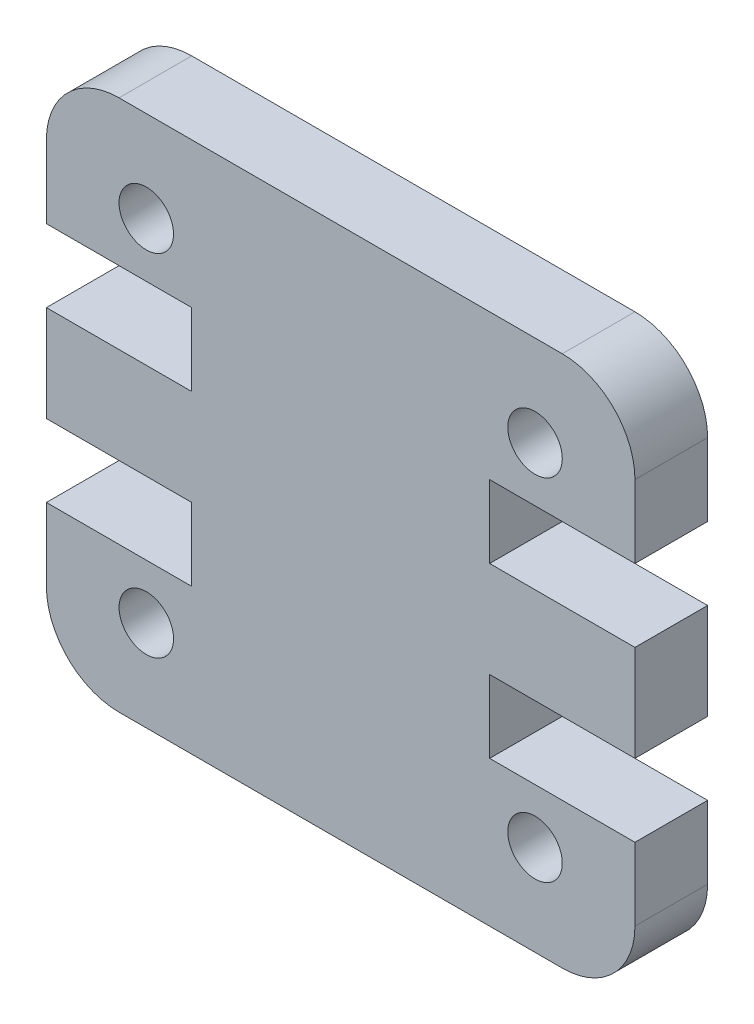
ISO-10303-21;
HEADER;
FILE_DESCRIPTION(('STEP AP214'),'2;1');
FILE_NAME('part.step','',(''),(''),'','','');
FILE_SCHEMA(('AUTOMOTIVE_DESIGN { 1 0 10303 214 1 1 1 1 }'));
ENDSEC;
DATA;
#1=APPLICATION_CONTEXT('core data for automotive mechanical design processes');
#2=APPLICATION_PROTOCOL_DEFINITION('international standard','automotive_design',2000,#1);
#3=PRODUCT_CONTEXT('',#1,'mechanical');
#4=PRODUCT('Part','Part','',(#3));
#5=PRODUCT_RELATED_PRODUCT_CATEGORY('part','',(#4));
#6=PRODUCT_DEFINITION_FORMATION('','',#4);
#7=PRODUCT_DEFINITION_CONTEXT('part definition',#1,'design');
#8=PRODUCT_DEFINITION('design','',#6,#7);
#9=PRODUCT_DEFINITION_SHAPE('','',#8);
#10=(LENGTH_UNIT() NAMED_UNIT(*) SI_UNIT(.MILLI.,.METRE.));
#11=(NAMED_UNIT(*) PLANE_ANGLE_UNIT() SI_UNIT($,.RADIAN.));
#12=(NAMED_UNIT(*) SI_UNIT($,.STERADIAN.) SOLID_ANGLE_UNIT());
#13=UNCERTAINTY_MEASURE_WITH_UNIT(LENGTH_MEASURE(1.E-05),#10,'distance_accuracy_value','');
#14=(GEOMETRIC_REPRESENTATION_CONTEXT(3) GLOBAL_UNCERTAINTY_ASSIGNED_CONTEXT((#13)) GLOBAL_UNIT_ASSIGNED_CONTEXT((#10,
#11,#12)) REPRESENTATION_CONTEXT('',''));
#15=CARTESIAN_POINT('',(0.,0.,0.));
#16=DIRECTION('',(0.,0.,1.));
#17=DIRECTION('',(1.,0.,0.));
#18=AXIS2_PLACEMENT_3D('',#15,#16,#17);
#19=CARTESIAN_POINT('',(14.2,2.,2.));
#20=DIRECTION('',(0.,0.,-1.));
#21=DIRECTION('',(-1.,0.,0.));
#22=AXIS2_PLACEMENT_3D('',#19,#20,#21);
#23=PLANE('',#22);
#24=CARTESIAN_POINT('',(13.4499999999986,12.1450000000001,2.));
#25=DIRECTION('',(0.,0.,1.));
#26=DIRECTION('',(1.,0.,0.));
#27=AXIS2_PLACEMENT_3D('',#24,#25,#26);
#28=CIRCLE('',#27,0.750000000000002);
#29=CARTESIAN_POINT('',(14.1999999999986,12.1450000000001,2.));
#30=VERTEX_POINT('',#29);
#31=EDGE_CURVE('E448',#30,#30,#28,.T.);
#32=ORIENTED_EDGE('',*,*,#31,.F.);
#33=EDGE_LOOP('',(#32));
#34=FACE_BOUND('',#33,.T.);
#35=CARTESIAN_POINT('',(13.4499999999986,2.4999999999999,2.));
#36=DIRECTION('',(0.,0.,1.));
#37=DIRECTION('',(-1.,0.,0.));
#38=AXIS2_PLACEMENT_3D('',#35,#36,#37);
#39=CIRCLE('',#38,0.750000000000002);
#40=CARTESIAN_POINT('',(12.6999999999986,2.4999999999999,2.));
#41=VERTEX_POINT('',#40);
#42=EDGE_CURVE('E230',#41,#41,#39,.T.);
#43=ORIENTED_EDGE('',*,*,#42,.F.);
#44=EDGE_LOOP('',(#43));
#45=FACE_BOUND('',#44,.T.);
#46=CARTESIAN_POINT('',(14.2,2.,2.));
#47=DIRECTION('',(0.,0.,1.));
#48=DIRECTION('',(-1.,0.,0.));
#49=AXIS2_PLACEMENT_3D('',#46,#47,#48);
#50=CIRCLE('',#49,2.);
#51=CARTESIAN_POINT('',(14.2,0.,2.));
#52=VERTEX_POINT('',#51);
#53=CARTESIAN_POINT('',(16.2,2.,2.));
#54=VERTEX_POINT('',#53);
#55=EDGE_CURVE('E273',#52,#54,#50,.T.);
#56=ORIENTED_EDGE('',*,*,#55,.T.);
#57=DIRECTION('',(0.,1.,0.));
#58=VECTOR('',#57,1.);
#59=CARTESIAN_POINT('',(16.2,4.,2.));
#60=LINE('',#59,#58);
#61=CARTESIAN_POINT('',(16.2,4.,2.));
#62=VERTEX_POINT('',#61);
#63=EDGE_CURVE('E141',#54,#62,#60,.T.);
#64=ORIENTED_EDGE('',*,*,#63,.T.);
#65=DIRECTION('',(-1.,0.,0.));
#66=VECTOR('',#65,1.);
#67=CARTESIAN_POINT('',(12.2,4.,2.));
#68=LINE('',#67,#66);
#69=CARTESIAN_POINT('',(12.2,4.,2.));
#70=VERTEX_POINT('',#69);
#71=EDGE_CURVE('E336',#62,#70,#68,.T.);
#72=ORIENTED_EDGE('',*,*,#71,.T.);
#73=DIRECTION('',(0.,1.,0.));
#74=VECTOR('',#73,1.);
#75=CARTESIAN_POINT('',(12.2,6.,2.));
#76=LINE('',#75,#74);
#77=CARTESIAN_POINT('',(12.2,6.,2.));
#78=VERTEX_POINT('',#77);
#79=EDGE_CURVE('E355',#70,#78,#76,.T.);
#80=ORIENTED_EDGE('',*,*,#79,.T.);
#81=DIRECTION('',(1.,0.,0.));
#82=VECTOR('',#81,1.);
#83=CARTESIAN_POINT('',(16.2,6.,2.));
#84=LINE('',#83,#82);
#85=CARTESIAN_POINT('',(16.2,6.,2.));
#86=VERTEX_POINT('',#85);
#87=EDGE_CURVE('E352',#78,#86,#84,.T.);
#88=ORIENTED_EDGE('',*,*,#87,.T.);
#89=DIRECTION('',(0.,1.,0.));
#90=VECTOR('',#89,1.);
#91=CARTESIAN_POINT('',(16.2,8.645,2.));
#92=LINE('',#91,#90);
#93=CARTESIAN_POINT('',(16.2,8.645,2.));
#94=VERTEX_POINT('',#93);
#95=EDGE_CURVE('E354',#86,#94,#92,.T.);
#96=ORIENTED_EDGE('',*,*,#95,.T.);
#97=DIRECTION('',(-1.,0.,0.));
#98=VECTOR('',#97,1.);
#99=CARTESIAN_POINT('',(16.2,8.645,2.));
#100=LINE('',#99,#98);
#101=CARTESIAN_POINT('',(12.2,8.645,2.));
#102=VERTEX_POINT('',#101);
#103=EDGE_CURVE('E357',#94,#102,#100,.T.);
#104=ORIENTED_EDGE('',*,*,#103,.T.);
#105=DIRECTION('',(0.,1.,0.));
#106=VECTOR('',#105,1.);
#107=CARTESIAN_POINT('',(12.2,8.645,2.));
#108=LINE('',#107,#106);
#109=CARTESIAN_POINT('',(12.2,10.645,2.));
#110=VERTEX_POINT('',#109);
#111=EDGE_CURVE('E363',#102,#110,#108,.T.);
#112=ORIENTED_EDGE('',*,*,#111,.T.);
#113=DIRECTION('',(1.,0.,0.));
#114=VECTOR('',#113,1.);
#115=CARTESIAN_POINT('',(12.2,10.645,2.));
#116=LINE('',#115,#114);
#117=CARTESIAN_POINT('',(16.2,10.645,2.));
#118=VERTEX_POINT('',#117);
#119=EDGE_CURVE('E365',#110,#118,#116,.T.);
#120=ORIENTED_EDGE('',*,*,#119,.T.);
#121=DIRECTION('',(0.,1.,0.));
#122=VECTOR('',#121,1.);
#123=CARTESIAN_POINT('',(16.2,10.645,2.));
#124=LINE('',#123,#122);
#125=CARTESIAN_POINT('',(16.2,12.645,2.));
#126=VERTEX_POINT('',#125);
#127=EDGE_CURVE('E367',#118,#126,#124,.T.);
#128=ORIENTED_EDGE('',*,*,#127,.T.);
#129=CARTESIAN_POINT('',(14.2,12.645,2.));
#130=DIRECTION('',(0.,0.,1.));
#131=DIRECTION('',(1.,0.,0.));
#132=AXIS2_PLACEMENT_3D('',#129,#130,#131);
#133=CIRCLE('',#132,2.);
#134=CARTESIAN_POINT('',(14.2,14.645,2.));
#135=VERTEX_POINT('',#134);
#136=EDGE_CURVE('E369',#126,#135,#133,.T.);
#137=ORIENTED_EDGE('',*,*,#136,.T.);
#138=DIRECTION('',(-1.,0.,0.));
#139=VECTOR('',#138,1.);
#140=CARTESIAN_POINT('',(2.,14.645,2.));
#141=LINE('',#140,#139);
#142=CARTESIAN_POINT('',(2.,14.645,2.));
#143=VERTEX_POINT('',#142);
#144=EDGE_CURVE('E371',#135,#143,#141,.T.);
#145=ORIENTED_EDGE('',*,*,#144,.T.);
#146=CARTESIAN_POINT('',(2.,12.645,2.));
#147=DIRECTION('',(0.,0.,1.));
#148=DIRECTION('',(-1.,0.,0.));
#149=AXIS2_PLACEMENT_3D('',#146,#147,#148);
#150=CIRCLE('',#149,2.);
#151=CARTESIAN_POINT('',(0.,12.645,2.));
#152=VERTEX_POINT('',#151);
#153=EDGE_CURVE('E373',#143,#152,#150,.T.);
#154=ORIENTED_EDGE('',*,*,#153,.T.);
#155=DIRECTION('',(0.,-1.,0.));
#156=VECTOR('',#155,1.);
#157=CARTESIAN_POINT('',(0.,10.645,2.));
#158=LINE('',#157,#156);
#159=CARTESIAN_POINT('',(0.,10.645,2.));
#160=VERTEX_POINT('',#159);
#161=EDGE_CURVE('E375',#152,#160,#158,.T.);
#162=ORIENTED_EDGE('',*,*,#161,.T.);
#163=DIRECTION('',(1.,0.,0.));
#164=VECTOR('',#163,1.);
#165=CARTESIAN_POINT('',(4.,10.645,2.));
#166=LINE('',#165,#164);
#167=CARTESIAN_POINT('',(4.,10.645,2.));
#168=VERTEX_POINT('',#167);
#169=EDGE_CURVE('E377',#160,#168,#166,.T.);
#170=ORIENTED_EDGE('',*,*,#169,.T.);
#171=DIRECTION('',(0.,-1.,0.));
#172=VECTOR('',#171,1.);
#173=CARTESIAN_POINT('',(4.,8.645,2.));
#174=LINE('',#173,#172);
#175=CARTESIAN_POINT('',(4.,8.645,2.));
#176=VERTEX_POINT('',#175);
#177=EDGE_CURVE('E379',#168,#176,#174,.T.);
#178=ORIENTED_EDGE('',*,*,#177,.T.);
#179=DIRECTION('',(-1.,0.,0.));
#180=VECTOR('',#179,1.);
#181=CARTESIAN_POINT('',(0.,8.645,2.));
#182=LINE('',#181,#180);
#183=CARTESIAN_POINT('',(0.,8.645,2.));
#184=VERTEX_POINT('',#183);
#185=EDGE_CURVE('E381',#176,#184,#182,.T.);
#186=ORIENTED_EDGE('',*,*,#185,.T.);
#187=DIRECTION('',(0.,-1.,0.));
#188=VECTOR('',#187,1.);
#189=CARTESIAN_POINT('',(0.,8.645,2.));
#190=LINE('',#189,#188);
#191=CARTESIAN_POINT('',(0.,6.00000000000003,2.));
#192=VERTEX_POINT('',#191);
#193=EDGE_CURVE('E383',#184,#192,#190,.T.);
#194=ORIENTED_EDGE('',*,*,#193,.T.);
#195=DIRECTION('',(1.,0.,0.));
#196=VECTOR('',#195,1.);
#197=CARTESIAN_POINT('',(0.,6.00000000000003,2.));
#198=LINE('',#197,#196);
#199=CARTESIAN_POINT('',(4.00000000000003,6.00000000000003,2.));
#200=VERTEX_POINT('',#199);
#201=EDGE_CURVE('E385',#192,#200,#198,.T.);
#202=ORIENTED_EDGE('',*,*,#201,.T.);
#203=DIRECTION('',(0.,-1.,0.));
#204=VECTOR('',#203,1.);
#205=CARTESIAN_POINT('',(4.00000000000003,6.00000000000003,2.));
#206=LINE('',#205,#204);
#207=CARTESIAN_POINT('',(4.00000000000003,4.00000000000002,2.));
#208=VERTEX_POINT('',#207);
#209=EDGE_CURVE('E387',#200,#208,#206,.T.);
#210=ORIENTED_EDGE('',*,*,#209,.T.);
#211=DIRECTION('',(-1.,0.,0.));
#212=VECTOR('',#211,1.);
#213=CARTESIAN_POINT('',(4.00000000000003,4.00000000000002,2.));
#214=LINE('',#213,#212);
#215=CARTESIAN_POINT('',(0.,4.00000000000003,2.));
#216=VERTEX_POINT('',#215);
#217=EDGE_CURVE('E208',#208,#216,#214,.T.);
#218=ORIENTED_EDGE('',*,*,#217,.T.);
#219=DIRECTION('',(0.,-1.,0.));
#220=VECTOR('',#219,1.);
#221=CARTESIAN_POINT('',(0.,4.00000000000003,2.));
#222=LINE('',#221,#220);
#223=CARTESIAN_POINT('',(0.,2.00000000000003,2.));
#224=VERTEX_POINT('',#223);
#225=EDGE_CURVE('E202',#216,#224,#222,.T.);
#226=ORIENTED_EDGE('',*,*,#225,.T.);
#227=CARTESIAN_POINT('',(2.,2.,2.));
#228=DIRECTION('',(0.,0.,1.));
#229=DIRECTION('',(1.,0.,0.));
#230=AXIS2_PLACEMENT_3D('',#227,#228,#229);
#231=CIRCLE('',#230,2.);
#232=CARTESIAN_POINT('',(2.,0.,2.));
#233=VERTEX_POINT('',#232);
#234=EDGE_CURVE('E206',#224,#233,#231,.T.);
#235=ORIENTED_EDGE('',*,*,#234,.T.);
#236=DIRECTION('',(1.,0.,0.));
#237=VECTOR('',#236,1.);
#238=CARTESIAN_POINT('',(2.,0.,2.));
#239=LINE('',#238,#237);
#240=EDGE_CURVE('E50',#233,#52,#239,.T.);
#241=ORIENTED_EDGE('',*,*,#240,.T.);
#242=EDGE_LOOP('',(#56,#64,#72,#80,#88,#96,#104,#112,#120,#128,#137,#145,#154,#162,#170,#178,
#186,#194,#202,#210,#218,#226,#235,#241));
#243=FACE_BOUND('',#242,.T.);
#244=CARTESIAN_POINT('',(2.75000000000139,12.1450000000001,2.));
#245=DIRECTION('',(0.,0.,1.));
#246=DIRECTION('',(-1.,0.,0.));
#247=AXIS2_PLACEMENT_3D('',#244,#245,#246);
#248=CIRCLE('',#247,0.750000000000001);
#249=CARTESIAN_POINT('',(2.00000000000139,12.1450000000001,2.));
#250=VERTEX_POINT('',#249);
#251=EDGE_CURVE('E454',#250,#250,#248,.T.);
#252=ORIENTED_EDGE('',*,*,#251,.F.);
#253=EDGE_LOOP('',(#252));
#254=FACE_BOUND('',#253,.T.);
#255=CARTESIAN_POINT('',(2.75000000000139,2.4999999999999,2.));
#256=DIRECTION('',(0.,0.,1.));
#257=DIRECTION('',(1.,0.,0.));
#258=AXIS2_PLACEMENT_3D('',#255,#256,#257);
#259=CIRCLE('',#258,0.75);
#260=CARTESIAN_POINT('',(3.50000000000139,2.4999999999999,2.));
#261=VERTEX_POINT('',#260);
#262=EDGE_CURVE('E439',#261,#261,#259,.T.);
#263=ORIENTED_EDGE('',*,*,#262,.F.);
#264=EDGE_LOOP('',(#263));
#265=FACE_BOUND('',#264,.T.);
#266=ADVANCED_FACE('F33',(#34,#45,#243,#254,#265),#23,.F.);
#267=CARTESIAN_POINT('',(14.2,2.,0.));
#268=DIRECTION('',(0.,0.,-1.));
#269=DIRECTION('',(-1.,0.,0.));
#270=AXIS2_PLACEMENT_3D('',#267,#268,#269);
#271=PLANE('',#270);
#272=CARTESIAN_POINT('',(13.4499999999986,12.1450000000001,0.));
#273=DIRECTION('',(0.,0.,1.));
#274=DIRECTION('',(1.,0.,0.));
#275=AXIS2_PLACEMENT_3D('',#272,#273,#274);
#276=CIRCLE('',#275,0.750000000000002);
#277=CARTESIAN_POINT('',(14.1999999999986,12.1450000000001,0.));
#278=VERTEX_POINT('',#277);
#279=EDGE_CURVE('E445',#278,#278,#276,.T.);
#280=ORIENTED_EDGE('',*,*,#279,.T.);
#281=EDGE_LOOP('',(#280));
#282=FACE_BOUND('',#281,.T.);
#283=CARTESIAN_POINT('',(13.4499999999986,2.4999999999999,0.));
#284=DIRECTION('',(0.,0.,1.));
#285=DIRECTION('',(-1.,0.,0.));
#286=AXIS2_PLACEMENT_3D('',#283,#284,#285);
#287=CIRCLE('',#286,0.750000000000002);
#288=CARTESIAN_POINT('',(12.6999999999986,2.4999999999999,0.));
#289=VERTEX_POINT('',#288);
#290=EDGE_CURVE('E457',#289,#289,#287,.T.);
#291=ORIENTED_EDGE('',*,*,#290,.T.);
#292=EDGE_LOOP('',(#291));
#293=FACE_BOUND('',#292,.T.);
#294=CARTESIAN_POINT('',(14.2,2.,0.));
#295=DIRECTION('',(0.,0.,1.));
#296=DIRECTION('',(-1.,0.,0.));
#297=AXIS2_PLACEMENT_3D('',#294,#295,#296);
#298=CIRCLE('',#297,2.);
#299=CARTESIAN_POINT('',(14.2,0.,0.));
#300=VERTEX_POINT('',#299);
#301=CARTESIAN_POINT('',(16.2,2.,0.));
#302=VERTEX_POINT('',#301);
#303=EDGE_CURVE('E226',#300,#302,#298,.T.);
#304=ORIENTED_EDGE('',*,*,#303,.F.);
#305=DIRECTION('',(1.,0.,0.));
#306=VECTOR('',#305,1.);
#307=CARTESIAN_POINT('',(2.,0.,0.));
#308=LINE('',#307,#306);
#309=CARTESIAN_POINT('',(2.,0.,0.));
#310=VERTEX_POINT('',#309);
#311=EDGE_CURVE('E133',#310,#300,#308,.T.);
#312=ORIENTED_EDGE('',*,*,#311,.F.);
#313=CARTESIAN_POINT('',(2.,2.,0.));
#314=DIRECTION('',(0.,0.,1.));
#315=DIRECTION('',(1.,0.,0.));
#316=AXIS2_PLACEMENT_3D('',#313,#314,#315);
#317=CIRCLE('',#316,2.);
#318=CARTESIAN_POINT('',(0.,2.00000000000003,0.));
#319=VERTEX_POINT('',#318);
#320=EDGE_CURVE('E127',#319,#310,#317,.T.);
#321=ORIENTED_EDGE('',*,*,#320,.F.);
#322=DIRECTION('',(0.,-1.,0.));
#323=VECTOR('',#322,1.);
#324=CARTESIAN_POINT('',(0.,4.00000000000003,0.));
#325=LINE('',#324,#323);
#326=CARTESIAN_POINT('',(0.,4.00000000000003,0.));
#327=VERTEX_POINT('',#326);
#328=EDGE_CURVE('E216',#327,#319,#325,.T.);
#329=ORIENTED_EDGE('',*,*,#328,.F.);
#330=DIRECTION('',(-1.,0.,0.));
#331=VECTOR('',#330,1.);
#332=CARTESIAN_POINT('',(4.00000000000003,4.00000000000002,0.));
#333=LINE('',#332,#331);
#334=CARTESIAN_POINT('',(4.00000000000003,4.00000000000002,0.));
#335=VERTEX_POINT('',#334);
#336=EDGE_CURVE('E268',#335,#327,#333,.T.);
#337=ORIENTED_EDGE('',*,*,#336,.F.);
#338=DIRECTION('',(0.,-1.,0.));
#339=VECTOR('',#338,1.);
#340=CARTESIAN_POINT('',(4.00000000000003,6.00000000000003,0.));
#341=LINE('',#340,#339);
#342=CARTESIAN_POINT('',(4.00000000000003,6.00000000000003,0.));
#343=VERTEX_POINT('',#342);
#344=EDGE_CURVE('E266',#343,#335,#341,.T.);
#345=ORIENTED_EDGE('',*,*,#344,.F.);
#346=DIRECTION('',(1.,0.,0.));
#347=VECTOR('',#346,1.);
#348=CARTESIAN_POINT('',(0.,6.00000000000003,0.));
#349=LINE('',#348,#347);
#350=CARTESIAN_POINT('',(0.,6.00000000000003,0.));
#351=VERTEX_POINT('',#350);
#352=EDGE_CURVE('E264',#351,#343,#349,.T.);
#353=ORIENTED_EDGE('',*,*,#352,.F.);
#354=DIRECTION('',(0.,-1.,0.));
#355=VECTOR('',#354,1.);
#356=CARTESIAN_POINT('',(0.,8.645,0.));
#357=LINE('',#356,#355);
#358=CARTESIAN_POINT('',(0.,8.645,0.));
#359=VERTEX_POINT('',#358);
#360=EDGE_CURVE('E262',#359,#351,#357,.T.);
#361=ORIENTED_EDGE('',*,*,#360,.F.);
#362=DIRECTION('',(-1.,0.,0.));
#363=VECTOR('',#362,1.);
#364=CARTESIAN_POINT('',(0.,8.645,0.));
#365=LINE('',#364,#363);
#366=CARTESIAN_POINT('',(4.,8.645,0.));
#367=VERTEX_POINT('',#366);
#368=EDGE_CURVE('E260',#367,#359,#365,.T.);
#369=ORIENTED_EDGE('',*,*,#368,.F.);
#370=DIRECTION('',(0.,-1.,0.));
#371=VECTOR('',#370,1.);
#372=CARTESIAN_POINT('',(4.,8.645,0.));
#373=LINE('',#372,#371);
#374=CARTESIAN_POINT('',(4.,10.645,0.));
#375=VERTEX_POINT('',#374);
#376=EDGE_CURVE('E258',#375,#367,#373,.T.);
#377=ORIENTED_EDGE('',*,*,#376,.F.);
#378=DIRECTION('',(1.,0.,0.));
#379=VECTOR('',#378,1.);
#380=CARTESIAN_POINT('',(4.,10.645,0.));
#381=LINE('',#380,#379);
#382=CARTESIAN_POINT('',(0.,10.645,0.));
#383=VERTEX_POINT('',#382);
#384=EDGE_CURVE('E256',#383,#375,#381,.T.);
#385=ORIENTED_EDGE('',*,*,#384,.F.);
#386=DIRECTION('',(0.,-1.,0.));
#387=VECTOR('',#386,1.);
#388=CARTESIAN_POINT('',(0.,10.645,0.));
#389=LINE('',#388,#387);
#390=CARTESIAN_POINT('',(0.,12.645,0.));
#391=VERTEX_POINT('',#390);
#392=EDGE_CURVE('E254',#391,#383,#389,.T.);
#393=ORIENTED_EDGE('',*,*,#392,.F.);
#394=CARTESIAN_POINT('',(2.,12.645,0.));
#395=DIRECTION('',(0.,0.,1.));
#396=DIRECTION('',(-1.,0.,0.));
#397=AXIS2_PLACEMENT_3D('',#394,#395,#396);
#398=CIRCLE('',#397,2.);
#399=CARTESIAN_POINT('',(2.,14.645,0.));
#400=VERTEX_POINT('',#399);
#401=EDGE_CURVE('E252',#400,#391,#398,.T.);
#402=ORIENTED_EDGE('',*,*,#401,.F.);
#403=DIRECTION('',(-1.,0.,0.));
#404=VECTOR('',#403,1.);
#405=CARTESIAN_POINT('',(2.,14.645,0.));
#406=LINE('',#405,#404);
#407=CARTESIAN_POINT('',(14.2,14.645,0.));
#408=VERTEX_POINT('',#407);
#409=EDGE_CURVE('E250',#408,#400,#406,.T.);
#410=ORIENTED_EDGE('',*,*,#409,.F.);
#411=CARTESIAN_POINT('',(14.2,12.645,0.));
#412=DIRECTION('',(0.,0.,1.));
#413=DIRECTION('',(1.,0.,0.));
#414=AXIS2_PLACEMENT_3D('',#411,#412,#413);
#415=CIRCLE('',#414,2.);
#416=CARTESIAN_POINT('',(16.2,12.645,0.));
#417=VERTEX_POINT('',#416);
#418=EDGE_CURVE('E248',#417,#408,#415,.T.);
#419=ORIENTED_EDGE('',*,*,#418,.F.);
#420=DIRECTION('',(0.,1.,0.));
#421=VECTOR('',#420,1.);
#422=CARTESIAN_POINT('',(16.2,10.645,0.));
#423=LINE('',#422,#421);
#424=CARTESIAN_POINT('',(16.2,10.645,0.));
#425=VERTEX_POINT('',#424);
#426=EDGE_CURVE('E246',#425,#417,#423,.T.);
#427=ORIENTED_EDGE('',*,*,#426,.F.);
#428=DIRECTION('',(1.,0.,0.));
#429=VECTOR('',#428,1.);
#430=CARTESIAN_POINT('',(12.2,10.645,0.));
#431=LINE('',#430,#429);
#432=CARTESIAN_POINT('',(12.2,10.645,0.));
#433=VERTEX_POINT('',#432);
#434=EDGE_CURVE('E244',#433,#425,#431,.T.);
#435=ORIENTED_EDGE('',*,*,#434,.F.);
#436=DIRECTION('',(0.,1.,0.));
#437=VECTOR('',#436,1.);
#438=CARTESIAN_POINT('',(12.2,8.645,0.));
#439=LINE('',#438,#437);
#440=CARTESIAN_POINT('',(12.2,8.645,0.));
#441=VERTEX_POINT('',#440);
#442=EDGE_CURVE('E242',#441,#433,#439,.T.);
#443=ORIENTED_EDGE('',*,*,#442,.F.);
#444=DIRECTION('',(-1.,0.,0.));
#445=VECTOR('',#444,1.);
#446=CARTESIAN_POINT('',(16.2,8.645,0.));
#447=LINE('',#446,#445);
#448=CARTESIAN_POINT('',(16.2,8.645,0.));
#449=VERTEX_POINT('',#448);
#450=EDGE_CURVE('E240',#449,#441,#447,.T.);
#451=ORIENTED_EDGE('',*,*,#450,.F.);
#452=DIRECTION('',(0.,1.,0.));
#453=VECTOR('',#452,1.);
#454=CARTESIAN_POINT('',(16.2,8.645,0.));
#455=LINE('',#454,#453);
#456=CARTESIAN_POINT('',(16.2,6.,0.));
#457=VERTEX_POINT('',#456);
#458=EDGE_CURVE('E238',#457,#449,#455,.T.);
#459=ORIENTED_EDGE('',*,*,#458,.F.);
#460=DIRECTION('',(1.,0.,0.));
#461=VECTOR('',#460,1.);
#462=CARTESIAN_POINT('',(16.2,6.,0.));
#463=LINE('',#462,#461);
#464=CARTESIAN_POINT('',(12.2,6.,0.));
#465=VERTEX_POINT('',#464);
#466=EDGE_CURVE('E236',#465,#457,#463,.T.);
#467=ORIENTED_EDGE('',*,*,#466,.F.);
#468=DIRECTION('',(0.,1.,0.));
#469=VECTOR('',#468,1.);
#470=CARTESIAN_POINT('',(12.2,6.,0.));
#471=LINE('',#470,#469);
#472=CARTESIAN_POINT('',(12.2,4.,0.));
#473=VERTEX_POINT('',#472);
#474=EDGE_CURVE('E234',#473,#465,#471,.T.);
#475=ORIENTED_EDGE('',*,*,#474,.F.);
#476=DIRECTION('',(-1.,0.,0.));
#477=VECTOR('',#476,1.);
#478=CARTESIAN_POINT('',(12.2,4.,0.));
#479=LINE('',#478,#477);
#480=CARTESIAN_POINT('',(16.2,4.,0.));
#481=VERTEX_POINT('',#480);
#482=EDGE_CURVE('E232',#481,#473,#479,.T.);
#483=ORIENTED_EDGE('',*,*,#482,.F.);
#484=DIRECTION('',(0.,1.,0.));
#485=VECTOR('',#484,1.);
#486=CARTESIAN_POINT('',(16.2,4.,0.));
#487=LINE('',#486,#485);
#488=EDGE_CURVE('E229',#302,#481,#487,.T.);
#489=ORIENTED_EDGE('',*,*,#488,.F.);
#490=EDGE_LOOP('',(#304,#312,#321,#329,#337,#345,#353,#361,#369,#377,#385,#393,#402,#410,#419,
#427,#435,#443,#451,#459,#467,#475,#483,#489));
#491=FACE_BOUND('',#490,.T.);
#492=CARTESIAN_POINT('',(2.75000000000139,12.1450000000001,0.));
#493=DIRECTION('',(0.,0.,1.));
#494=DIRECTION('',(-1.,0.,0.));
#495=AXIS2_PLACEMENT_3D('',#492,#493,#494);
#496=CIRCLE('',#495,0.750000000000001);
#497=CARTESIAN_POINT('',(2.00000000000139,12.1450000000001,0.));
#498=VERTEX_POINT('',#497);
#499=EDGE_CURVE('E451',#498,#498,#496,.T.);
#500=ORIENTED_EDGE('',*,*,#499,.T.);
#501=EDGE_LOOP('',(#500));
#502=FACE_BOUND('',#501,.T.);
#503=CARTESIAN_POINT('',(2.75000000000139,2.4999999999999,0.));
#504=DIRECTION('',(0.,0.,1.));
#505=DIRECTION('',(1.,0.,0.));
#506=AXIS2_PLACEMENT_3D('',#503,#504,#505);
#507=CIRCLE('',#506,0.75);
#508=CARTESIAN_POINT('',(3.50000000000139,2.4999999999999,0.));
#509=VERTEX_POINT('',#508);
#510=EDGE_CURVE('E442',#509,#509,#507,.T.);
#511=ORIENTED_EDGE('',*,*,#510,.T.);
#512=EDGE_LOOP('',(#511));
#513=FACE_BOUND('',#512,.T.);
#514=ADVANCED_FACE('F340',(#282,#293,#491,#502,#513),#271,.T.);
#515=CARTESIAN_POINT('',(14.2,2.,2.));
#516=DIRECTION('',(0.,0.,-1.));
#517=DIRECTION('',(-1.,0.,0.));
#518=AXIS2_PLACEMENT_3D('',#515,#516,#517);
#519=CYLINDRICAL_SURFACE('',#518,2.);
#520=ORIENTED_EDGE('',*,*,#303,.T.);
#521=DIRECTION('',(0.,0.,-1.));
#522=VECTOR('',#521,1.);
#523=CARTESIAN_POINT('',(16.2,2.,2.));
#524=LINE('',#523,#522);
#525=EDGE_CURVE('E11',#54,#302,#524,.T.);
#526=ORIENTED_EDGE('',*,*,#525,.F.);
#527=ORIENTED_EDGE('',*,*,#55,.F.);
#528=DIRECTION('',(0.,0.,-1.));
#529=VECTOR('',#528,1.);
#530=CARTESIAN_POINT('',(14.2,0.,2.));
#531=LINE('',#530,#529);
#532=EDGE_CURVE('E222',#52,#300,#531,.T.);
#533=ORIENTED_EDGE('',*,*,#532,.T.);
#534=EDGE_LOOP('',(#520,#526,#527,#533));
#535=FACE_BOUND('',#534,.T.);
#536=ADVANCED_FACE('F35',(#535),#519,.T.);
#537=CARTESIAN_POINT('',(16.2,4.,2.));
#538=DIRECTION('',(-1.,0.,0.));
#539=DIRECTION('',(0.,0.,1.));
#540=AXIS2_PLACEMENT_3D('',#537,#538,#539);
#541=PLANE('',#540);
#542=ORIENTED_EDGE('',*,*,#488,.T.);
#543=DIRECTION('',(0.,0.,-1.));
#544=VECTOR('',#543,1.);
#545=CARTESIAN_POINT('',(16.2,4.,2.));
#546=LINE('',#545,#544);
#547=EDGE_CURVE('E42',#62,#481,#546,.T.);
#548=ORIENTED_EDGE('',*,*,#547,.F.);
#549=ORIENTED_EDGE('',*,*,#63,.F.);
#550=ORIENTED_EDGE('',*,*,#525,.T.);
#551=EDGE_LOOP('',(#542,#548,#549,#550));
#552=FACE_BOUND('',#551,.T.);
#553=ADVANCED_FACE('F686',(#552),#541,.F.);
#554=CARTESIAN_POINT('',(12.2,4.,2.));
#555=DIRECTION('',(0.,-1.,0.));
#556=DIRECTION('',(0.,0.,-1.));
#557=AXIS2_PLACEMENT_3D('',#554,#555,#556);
#558=PLANE('',#557);
#559=ORIENTED_EDGE('',*,*,#482,.T.);
#560=DIRECTION('',(0.,0.,-1.));
#561=VECTOR('',#560,1.);
#562=CARTESIAN_POINT('',(12.2,4.,2.));
#563=LINE('',#562,#561);
#564=EDGE_CURVE('E328',#70,#473,#563,.T.);
#565=ORIENTED_EDGE('',*,*,#564,.F.);
#566=ORIENTED_EDGE('',*,*,#71,.F.);
#567=ORIENTED_EDGE('',*,*,#547,.T.);
#568=EDGE_LOOP('',(#559,#565,#566,#567));
#569=FACE_BOUND('',#568,.T.);
#570=ADVANCED_FACE('F334',(#569),#558,.F.);
#571=CARTESIAN_POINT('',(12.2,6.,2.));
#572=DIRECTION('',(-1.,0.,0.));
#573=DIRECTION('',(0.,-1.,0.));
#574=AXIS2_PLACEMENT_3D('',#571,#572,#573);
#575=PLANE('',#574);
#576=ORIENTED_EDGE('',*,*,#474,.T.);
#577=DIRECTION('',(0.,0.,-1.));
#578=VECTOR('',#577,1.);
#579=CARTESIAN_POINT('',(12.2,6.,2.));
#580=LINE('',#579,#578);
#581=EDGE_CURVE('E325',#78,#465,#580,.T.);
#582=ORIENTED_EDGE('',*,*,#581,.F.);
#583=ORIENTED_EDGE('',*,*,#79,.F.);
#584=ORIENTED_EDGE('',*,*,#564,.T.);
#585=EDGE_LOOP('',(#576,#582,#583,#584));
#586=FACE_BOUND('',#585,.T.);
#587=ADVANCED_FACE('F346',(#586),#575,.F.);
#588=CARTESIAN_POINT('',(16.2,6.,2.));
#589=DIRECTION('',(0.,1.,0.));
#590=DIRECTION('',(0.,0.,1.));
#591=AXIS2_PLACEMENT_3D('',#588,#589,#590);
#592=PLANE('',#591);
#593=ORIENTED_EDGE('',*,*,#466,.T.);
#594=DIRECTION('',(0.,0.,-1.));
#595=VECTOR('',#594,1.);
#596=CARTESIAN_POINT('',(16.2,6.,2.));
#597=LINE('',#596,#595);
#598=EDGE_CURVE('E322',#86,#457,#597,.T.);
#599=ORIENTED_EDGE('',*,*,#598,.F.);
#600=ORIENTED_EDGE('',*,*,#87,.F.);
#601=ORIENTED_EDGE('',*,*,#581,.T.);
#602=EDGE_LOOP('',(#593,#599,#600,#601));
#603=FACE_BOUND('',#602,.T.);
#604=ADVANCED_FACE('F350',(#603),#592,.F.);
#605=CARTESIAN_POINT('',(16.2,8.645,2.));
#606=DIRECTION('',(-1.,0.,0.));
#607=DIRECTION('',(0.,0.,1.));
#608=AXIS2_PLACEMENT_3D('',#605,#606,#607);
#609=PLANE('',#608);
#610=ORIENTED_EDGE('',*,*,#458,.T.);
#611=DIRECTION('',(0.,0.,-1.));
#612=VECTOR('',#611,1.);
#613=CARTESIAN_POINT('',(16.2,8.645,2.));
#614=LINE('',#613,#612);
#615=EDGE_CURVE('E319',#94,#449,#614,.T.);
#616=ORIENTED_EDGE('',*,*,#615,.F.);
#617=ORIENTED_EDGE('',*,*,#95,.F.);
#618=ORIENTED_EDGE('',*,*,#598,.T.);
#619=EDGE_LOOP('',(#610,#616,#617,#618));
#620=FACE_BOUND('',#619,.T.);
#621=ADVANCED_FACE('F651',(#620),#609,.F.);
#622=CARTESIAN_POINT('',(16.2,8.645,2.));
#623=DIRECTION('',(0.,-1.,0.));
#624=DIRECTION('',(0.,0.,-1.));
#625=AXIS2_PLACEMENT_3D('',#622,#623,#624);
#626=PLANE('',#625);
#627=ORIENTED_EDGE('',*,*,#450,.T.);
#628=DIRECTION('',(0.,0.,-1.));
#629=VECTOR('',#628,1.);
#630=CARTESIAN_POINT('',(12.2,8.645,2.));
#631=LINE('',#630,#629);
#632=EDGE_CURVE('E316',#102,#441,#631,.T.);
#633=ORIENTED_EDGE('',*,*,#632,.F.);
#634=ORIENTED_EDGE('',*,*,#103,.F.);
#635=ORIENTED_EDGE('',*,*,#615,.T.);
#636=EDGE_LOOP('',(#627,#633,#634,#635));
#637=FACE_BOUND('',#636,.T.);
#638=ADVANCED_FACE('F641',(#637),#626,.F.);
#639=CARTESIAN_POINT('',(12.2,8.645,2.));
#640=DIRECTION('',(-1.,0.,0.));
#641=DIRECTION('',(0.,-1.,0.));
#642=AXIS2_PLACEMENT_3D('',#639,#640,#641);
#643=PLANE('',#642);
#644=ORIENTED_EDGE('',*,*,#442,.T.);
#645=DIRECTION('',(0.,0.,-1.));
#646=VECTOR('',#645,1.);
#647=CARTESIAN_POINT('',(12.2,10.645,2.));
#648=LINE('',#647,#646);
#649=EDGE_CURVE('E313',#110,#433,#648,.T.);
#650=ORIENTED_EDGE('',*,*,#649,.F.);
#651=ORIENTED_EDGE('',*,*,#111,.F.);
#652=ORIENTED_EDGE('',*,*,#632,.T.);
#653=EDGE_LOOP('',(#644,#650,#651,#652));
#654=FACE_BOUND('',#653,.T.);
#655=ADVANCED_FACE('F631',(#654),#643,.F.);
#656=CARTESIAN_POINT('',(12.2,10.645,2.));
#657=DIRECTION('',(0.,1.,0.));
#658=DIRECTION('',(-1.,0.,0.));
#659=AXIS2_PLACEMENT_3D('',#656,#657,#658);
#660=PLANE('',#659);
#661=ORIENTED_EDGE('',*,*,#434,.T.);
#662=DIRECTION('',(0.,0.,-1.));
#663=VECTOR('',#662,1.);
#664=CARTESIAN_POINT('',(16.2,10.645,2.));
#665=LINE('',#664,#663);
#666=EDGE_CURVE('E310',#118,#425,#665,.T.);
#667=ORIENTED_EDGE('',*,*,#666,.F.);
#668=ORIENTED_EDGE('',*,*,#119,.F.);
#669=ORIENTED_EDGE('',*,*,#649,.T.);
#670=EDGE_LOOP('',(#661,#667,#668,#669));
#671=FACE_BOUND('',#670,.T.);
#672=ADVANCED_FACE('F621',(#671),#660,.F.);
#673=CARTESIAN_POINT('',(16.2,10.645,2.));
#674=DIRECTION('',(-1.,0.,0.));
#675=DIRECTION('',(0.,0.,1.));
#676=AXIS2_PLACEMENT_3D('',#673,#674,#675);
#677=PLANE('',#676);
#678=ORIENTED_EDGE('',*,*,#426,.T.);
#679=DIRECTION('',(0.,0.,-1.));
#680=VECTOR('',#679,1.);
#681=CARTESIAN_POINT('',(16.2,12.645,2.));
#682=LINE('',#681,#680);
#683=EDGE_CURVE('E307',#126,#417,#682,.T.);
#684=ORIENTED_EDGE('',*,*,#683,.F.);
#685=ORIENTED_EDGE('',*,*,#127,.F.);
#686=ORIENTED_EDGE('',*,*,#666,.T.);
#687=EDGE_LOOP('',(#678,#684,#685,#686));
#688=FACE_BOUND('',#687,.T.);
#689=ADVANCED_FACE('F611',(#688),#677,.F.);
#690=CARTESIAN_POINT('',(14.2,12.645,2.));
#691=DIRECTION('',(0.,0.,-1.));
#692=DIRECTION('',(-1.,0.,0.));
#693=AXIS2_PLACEMENT_3D('',#690,#691,#692);
#694=CYLINDRICAL_SURFACE('',#693,2.);
#695=ORIENTED_EDGE('',*,*,#418,.T.);
#696=DIRECTION('',(0.,0.,-1.));
#697=VECTOR('',#696,1.);
#698=CARTESIAN_POINT('',(14.2,14.645,2.));
#699=LINE('',#698,#697);
#700=EDGE_CURVE('E304',#135,#408,#699,.T.);
#701=ORIENTED_EDGE('',*,*,#700,.F.);
#702=ORIENTED_EDGE('',*,*,#136,.F.);
#703=ORIENTED_EDGE('',*,*,#683,.T.);
#704=EDGE_LOOP('',(#695,#701,#702,#703));
#705=FACE_BOUND('',#704,.T.);
#706=ADVANCED_FACE('F601',(#705),#694,.T.);
#707=CARTESIAN_POINT('',(2.,14.645,2.));
#708=DIRECTION('',(0.,-1.,0.));
#709=DIRECTION('',(0.,0.,-1.));
#710=AXIS2_PLACEMENT_3D('',#707,#708,#709);
#711=PLANE('',#710);
#712=ORIENTED_EDGE('',*,*,#409,.T.);
#713=DIRECTION('',(0.,0.,-1.));
#714=VECTOR('',#713,1.);
#715=CARTESIAN_POINT('',(2.,14.645,2.));
#716=LINE('',#715,#714);
#717=EDGE_CURVE('E301',#143,#400,#716,.T.);
#718=ORIENTED_EDGE('',*,*,#717,.F.);
#719=ORIENTED_EDGE('',*,*,#144,.F.);
#720=ORIENTED_EDGE('',*,*,#700,.T.);
#721=EDGE_LOOP('',(#712,#718,#719,#720));
#722=FACE_BOUND('',#721,.T.);
#723=ADVANCED_FACE('F591',(#722),#711,.F.);
#724=CARTESIAN_POINT('',(2.,12.645,2.));
#725=DIRECTION('',(0.,0.,-1.));
#726=DIRECTION('',(-1.,0.,0.));
#727=AXIS2_PLACEMENT_3D('',#724,#725,#726);
#728=CYLINDRICAL_SURFACE('',#727,2.);
#729=ORIENTED_EDGE('',*,*,#401,.T.);
#730=DIRECTION('',(0.,0.,-1.));
#731=VECTOR('',#730,1.);
#732=CARTESIAN_POINT('',(0.,12.645,2.));
#733=LINE('',#732,#731);
#734=EDGE_CURVE('E298',#152,#391,#733,.T.);
#735=ORIENTED_EDGE('',*,*,#734,.F.);
#736=ORIENTED_EDGE('',*,*,#153,.F.);
#737=ORIENTED_EDGE('',*,*,#717,.T.);
#738=EDGE_LOOP('',(#729,#735,#736,#737));
#739=FACE_BOUND('',#738,.T.);
#740=ADVANCED_FACE('F581',(#739),#728,.T.);
#741=CARTESIAN_POINT('',(0.,10.645,2.));
#742=DIRECTION('',(1.,0.,0.));
#743=DIRECTION('',(0.,0.,-1.));
#744=AXIS2_PLACEMENT_3D('',#741,#742,#743);
#745=PLANE('',#744);
#746=ORIENTED_EDGE('',*,*,#392,.T.);
#747=DIRECTION('',(0.,0.,-1.));
#748=VECTOR('',#747,1.);
#749=CARTESIAN_POINT('',(0.,10.645,2.));
#750=LINE('',#749,#748);
#751=EDGE_CURVE('E295',#160,#383,#750,.T.);
#752=ORIENTED_EDGE('',*,*,#751,.F.);
#753=ORIENTED_EDGE('',*,*,#161,.F.);
#754=ORIENTED_EDGE('',*,*,#734,.T.);
#755=EDGE_LOOP('',(#746,#752,#753,#754));
#756=FACE_BOUND('',#755,.T.);
#757=ADVANCED_FACE('F571',(#756),#745,.F.);
#758=CARTESIAN_POINT('',(4.,10.645,2.));
#759=DIRECTION('',(0.,1.,0.));
#760=DIRECTION('',(-1.,0.,0.));
#761=AXIS2_PLACEMENT_3D('',#758,#759,#760);
#762=PLANE('',#761);
#763=ORIENTED_EDGE('',*,*,#384,.T.);
#764=DIRECTION('',(0.,0.,-1.));
#765=VECTOR('',#764,1.);
#766=CARTESIAN_POINT('',(4.,10.645,2.));
#767=LINE('',#766,#765);
#768=EDGE_CURVE('E292',#168,#375,#767,.T.);
#769=ORIENTED_EDGE('',*,*,#768,.F.);
#770=ORIENTED_EDGE('',*,*,#169,.F.);
#771=ORIENTED_EDGE('',*,*,#751,.T.);
#772=EDGE_LOOP('',(#763,#769,#770,#771));
#773=FACE_BOUND('',#772,.T.);
#774=ADVANCED_FACE('F561',(#773),#762,.F.);
#775=CARTESIAN_POINT('',(4.,8.645,2.));
#776=DIRECTION('',(1.,0.,0.));
#777=DIRECTION('',(0.,1.,0.));
#778=AXIS2_PLACEMENT_3D('',#775,#776,#777);
#779=PLANE('',#778);
#780=ORIENTED_EDGE('',*,*,#376,.T.);
#781=DIRECTION('',(0.,0.,-1.));
#782=VECTOR('',#781,1.);
#783=CARTESIAN_POINT('',(4.,8.645,2.));
#784=LINE('',#783,#782);
#785=EDGE_CURVE('E289',#176,#367,#784,.T.);
#786=ORIENTED_EDGE('',*,*,#785,.F.);
#787=ORIENTED_EDGE('',*,*,#177,.F.);
#788=ORIENTED_EDGE('',*,*,#768,.T.);
#789=EDGE_LOOP('',(#780,#786,#787,#788));
#790=FACE_BOUND('',#789,.T.);
#791=ADVANCED_FACE('F551',(#790),#779,.F.);
#792=CARTESIAN_POINT('',(0.,8.645,2.));
#793=DIRECTION('',(0.,-1.,0.));
#794=DIRECTION('',(0.,0.,-1.));
#795=AXIS2_PLACEMENT_3D('',#792,#793,#794);
#796=PLANE('',#795);
#797=ORIENTED_EDGE('',*,*,#368,.T.);
#798=DIRECTION('',(0.,0.,-1.));
#799=VECTOR('',#798,1.);
#800=CARTESIAN_POINT('',(0.,8.645,2.));
#801=LINE('',#800,#799);
#802=EDGE_CURVE('E286',#184,#359,#801,.T.);
#803=ORIENTED_EDGE('',*,*,#802,.F.);
#804=ORIENTED_EDGE('',*,*,#185,.F.);
#805=ORIENTED_EDGE('',*,*,#785,.T.);
#806=EDGE_LOOP('',(#797,#803,#804,#805));
#807=FACE_BOUND('',#806,.T.);
#808=ADVANCED_FACE('F541',(#807),#796,.F.);
#809=CARTESIAN_POINT('',(0.,8.645,2.));
#810=DIRECTION('',(1.,0.,0.));
#811=DIRECTION('',(0.,1.,0.));
#812=AXIS2_PLACEMENT_3D('',#809,#810,#811);
#813=PLANE('',#812);
#814=ORIENTED_EDGE('',*,*,#360,.T.);
#815=DIRECTION('',(0.,0.,-1.));
#816=VECTOR('',#815,1.);
#817=CARTESIAN_POINT('',(0.,6.00000000000003,2.));
#818=LINE('',#817,#816);
#819=EDGE_CURVE('E283',#192,#351,#818,.T.);
#820=ORIENTED_EDGE('',*,*,#819,.F.);
#821=ORIENTED_EDGE('',*,*,#193,.F.);
#822=ORIENTED_EDGE('',*,*,#802,.T.);
#823=EDGE_LOOP('',(#814,#820,#821,#822));
#824=FACE_BOUND('',#823,.T.);
#825=ADVANCED_FACE('F531',(#824),#813,.F.);
#826=CARTESIAN_POINT('',(0.,6.00000000000003,2.));
#827=DIRECTION('',(0.,1.,0.));
#828=DIRECTION('',(-1.,0.,0.));
#829=AXIS2_PLACEMENT_3D('',#826,#827,#828);
#830=PLANE('',#829);
#831=ORIENTED_EDGE('',*,*,#352,.T.);
#832=DIRECTION('',(0.,0.,-1.));
#833=VECTOR('',#832,1.);
#834=CARTESIAN_POINT('',(4.00000000000003,6.00000000000003,2.));
#835=LINE('',#834,#833);
#836=EDGE_CURVE('E280',#200,#343,#835,.T.);
#837=ORIENTED_EDGE('',*,*,#836,.F.);
#838=ORIENTED_EDGE('',*,*,#201,.F.);
#839=ORIENTED_EDGE('',*,*,#819,.T.);
#840=EDGE_LOOP('',(#831,#837,#838,#839));
#841=FACE_BOUND('',#840,.T.);
#842=ADVANCED_FACE('F522',(#841),#830,.F.);
#843=CARTESIAN_POINT('',(4.00000000000003,6.00000000000003,2.));
#844=DIRECTION('',(1.,0.,0.));
#845=DIRECTION('',(0.,0.,-1.));
#846=AXIS2_PLACEMENT_3D('',#843,#844,#845);
#847=PLANE('',#846);
#848=ORIENTED_EDGE('',*,*,#344,.T.);
#849=DIRECTION('',(0.,0.,-1.));
#850=VECTOR('',#849,1.);
#851=CARTESIAN_POINT('',(4.00000000000003,4.00000000000002,2.));
#852=LINE('',#851,#850);
#853=EDGE_CURVE('E277',#208,#335,#852,.T.);
#854=ORIENTED_EDGE('',*,*,#853,.F.);
#855=ORIENTED_EDGE('',*,*,#209,.F.);
#856=ORIENTED_EDGE('',*,*,#836,.T.);
#857=EDGE_LOOP('',(#848,#854,#855,#856));
#858=FACE_BOUND('',#857,.T.);
#859=ADVANCED_FACE('F393',(#858),#847,.F.);
#860=CARTESIAN_POINT('',(4.00000000000003,4.00000000000002,2.));
#861=DIRECTION('',(0.,-1.,0.));
#862=DIRECTION('',(1.,0.,0.));
#863=AXIS2_PLACEMENT_3D('',#860,#861,#862);
#864=PLANE('',#863);
#865=ORIENTED_EDGE('',*,*,#336,.T.);
#866=DIRECTION('',(0.,0.,-1.));
#867=VECTOR('',#866,1.);
#868=CARTESIAN_POINT('',(0.,4.00000000000003,2.));
#869=LINE('',#868,#867);
#870=EDGE_CURVE('E217',#216,#327,#869,.T.);
#871=ORIENTED_EDGE('',*,*,#870,.F.);
#872=ORIENTED_EDGE('',*,*,#217,.F.);
#873=ORIENTED_EDGE('',*,*,#853,.T.);
#874=EDGE_LOOP('',(#865,#871,#872,#873));
#875=FACE_BOUND('',#874,.T.);
#876=ADVANCED_FACE('F397',(#875),#864,.F.);
#877=CARTESIAN_POINT('',(0.,4.00000000000003,2.));
#878=DIRECTION('',(1.,0.,0.));
#879=DIRECTION('',(0.,1.,0.));
#880=AXIS2_PLACEMENT_3D('',#877,#878,#879);
#881=PLANE('',#880);
#882=ORIENTED_EDGE('',*,*,#328,.T.);
#883=DIRECTION('',(0.,0.,-1.));
#884=VECTOR('',#883,1.);
#885=CARTESIAN_POINT('',(0.,2.00000000000003,2.));
#886=LINE('',#885,#884);
#887=EDGE_CURVE('E213',#224,#319,#886,.T.);
#888=ORIENTED_EDGE('',*,*,#887,.F.);
#889=ORIENTED_EDGE('',*,*,#225,.F.);
#890=ORIENTED_EDGE('',*,*,#870,.T.);
#891=EDGE_LOOP('',(#882,#888,#889,#890));
#892=FACE_BOUND('',#891,.T.);
#893=ADVANCED_FACE('F214',(#892),#881,.F.);
#894=CARTESIAN_POINT('',(2.,2.,2.));
#895=DIRECTION('',(0.,0.,-1.));
#896=DIRECTION('',(-1.,0.,0.));
#897=AXIS2_PLACEMENT_3D('',#894,#895,#896);
#898=CYLINDRICAL_SURFACE('',#897,2.);
#899=ORIENTED_EDGE('',*,*,#320,.T.);
#900=DIRECTION('',(0.,0.,-1.));
#901=VECTOR('',#900,1.);
#902=CARTESIAN_POINT('',(2.,0.,2.));
#903=LINE('',#902,#901);
#904=EDGE_CURVE('E218',#233,#310,#903,.T.);
#905=ORIENTED_EDGE('',*,*,#904,.F.);
#906=ORIENTED_EDGE('',*,*,#234,.F.);
#907=ORIENTED_EDGE('',*,*,#887,.T.);
#908=EDGE_LOOP('',(#899,#905,#906,#907));
#909=FACE_BOUND('',#908,.T.);
#910=ADVANCED_FACE('F220',(#909),#898,.T.);
#911=CARTESIAN_POINT('',(2.,0.,2.));
#912=DIRECTION('',(0.,1.,0.));
#913=DIRECTION('',(0.,0.,1.));
#914=AXIS2_PLACEMENT_3D('',#911,#912,#913);
#915=PLANE('',#914);
#916=ORIENTED_EDGE('',*,*,#311,.T.);
#917=ORIENTED_EDGE('',*,*,#532,.F.);
#918=ORIENTED_EDGE('',*,*,#240,.F.);
#919=ORIENTED_EDGE('',*,*,#904,.T.);
#920=EDGE_LOOP('',(#916,#917,#918,#919));
#921=FACE_BOUND('',#920,.T.);
#922=ADVANCED_FACE('F401',(#921),#915,.F.);
#923=CARTESIAN_POINT('',(13.4499999999986,2.4999999999999,2.));
#924=DIRECTION('',(0.,0.,-1.));
#925=DIRECTION('',(-1.,0.,0.));
#926=AXIS2_PLACEMENT_3D('',#923,#924,#925);
#927=CYLINDRICAL_SURFACE('',#926,0.750000000000002);
#928=ORIENTED_EDGE('',*,*,#42,.T.);
#929=EDGE_LOOP('',(#928));
#930=FACE_BOUND('',#929,.T.);
#931=ORIENTED_EDGE('',*,*,#290,.F.);
#932=EDGE_LOOP('',(#931));
#933=FACE_BOUND('',#932,.T.);
#934=ADVANCED_FACE('F403',(#930,#933),#927,.F.);
#935=CARTESIAN_POINT('',(2.75000000000139,12.1450000000001,2.));
#936=DIRECTION('',(0.,0.,-1.));
#937=DIRECTION('',(-1.,0.,0.));
#938=AXIS2_PLACEMENT_3D('',#935,#936,#937);
#939=CYLINDRICAL_SURFACE('',#938,0.750000000000001);
#940=ORIENTED_EDGE('',*,*,#251,.T.);
#941=EDGE_LOOP('',(#940));
#942=FACE_BOUND('',#941,.T.);
#943=ORIENTED_EDGE('',*,*,#499,.F.);
#944=EDGE_LOOP('',(#943));
#945=FACE_BOUND('',#944,.T.);
#946=ADVANCED_FACE('F409',(#942,#945),#939,.F.);
#947=CARTESIAN_POINT('',(13.4499999999986,12.1450000000001,2.));
#948=DIRECTION('',(0.,0.,-1.));
#949=DIRECTION('',(-1.,0.,0.));
#950=AXIS2_PLACEMENT_3D('',#947,#948,#949);
#951=CYLINDRICAL_SURFACE('',#950,0.750000000000002);
#952=ORIENTED_EDGE('',*,*,#31,.T.);
#953=EDGE_LOOP('',(#952));
#954=FACE_BOUND('',#953,.T.);
#955=ORIENTED_EDGE('',*,*,#279,.F.);
#956=EDGE_LOOP('',(#955));
#957=FACE_BOUND('',#956,.T.);
#958=ADVANCED_FACE('F426',(#954,#957),#951,.F.);
#959=CARTESIAN_POINT('',(2.75000000000139,2.4999999999999,2.));
#960=DIRECTION('',(0.,0.,-1.));
#961=DIRECTION('',(-1.,0.,0.));
#962=AXIS2_PLACEMENT_3D('',#959,#960,#961);
#963=CYLINDRICAL_SURFACE('',#962,0.75);
#964=ORIENTED_EDGE('',*,*,#262,.T.);
#965=EDGE_LOOP('',(#964));
#966=FACE_BOUND('',#965,.T.);
#967=ORIENTED_EDGE('',*,*,#510,.F.);
#968=EDGE_LOOP('',(#967));
#969=FACE_BOUND('',#968,.T.);
#970=ADVANCED_FACE('F430',(#966,#969),#963,.F.);
#971=CLOSED_SHELL('',(#266,#514,#536,#553,#570,#587,#604,#621,#638,#655,#672,#689,#706,#723,
#740,#757,#774,#791,#808,#825,#842,#859,#876,#893,#910,#922,#934,#946,#958,#970));
#972=MANIFOLD_SOLID_BREP('B2',#971);
#973=ADVANCED_BREP_SHAPE_REPRESENTATION('',(#18,#972),#14);
#974=SHAPE_DEFINITION_REPRESENTATION(#9,#973);
ENDSEC;
END-ISO-10303-21;
